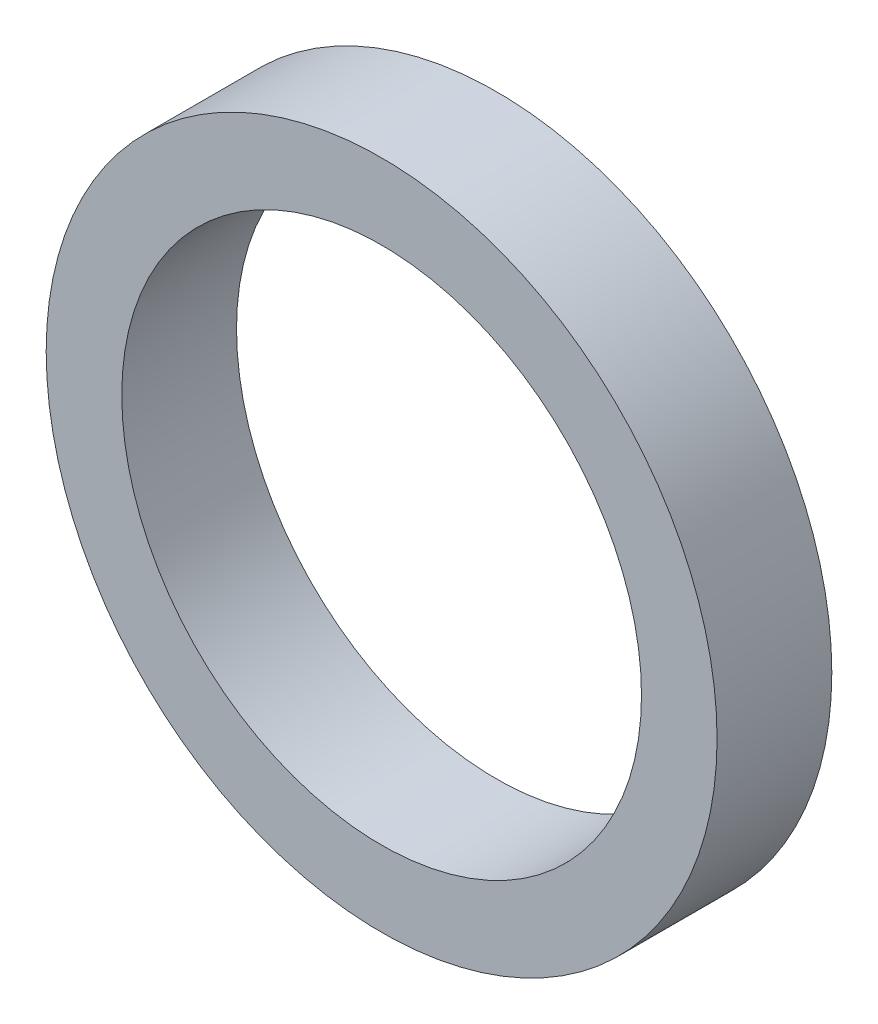
ISO-10303-21;
HEADER;
FILE_DESCRIPTION(('STEP AP214'),'2;1');
FILE_NAME('part.step','',(''),(''),'','','');
FILE_SCHEMA(('AUTOMOTIVE_DESIGN { 1 0 10303 214 1 1 1 1 }'));
ENDSEC;
DATA;
#1=APPLICATION_CONTEXT('core data for automotive mechanical design processes');
#2=APPLICATION_PROTOCOL_DEFINITION('international standard','automotive_design',2000,#1);
#3=PRODUCT_CONTEXT('',#1,'mechanical');
#4=PRODUCT('Part','Part','',(#3));
#5=PRODUCT_RELATED_PRODUCT_CATEGORY('part','',(#4));
#6=PRODUCT_DEFINITION_FORMATION('','',#4);
#7=PRODUCT_DEFINITION_CONTEXT('part definition',#1,'design');
#8=PRODUCT_DEFINITION('design','',#6,#7);
#9=PRODUCT_DEFINITION_SHAPE('','',#8);
#10=(LENGTH_UNIT() NAMED_UNIT(*) SI_UNIT(.MILLI.,.METRE.));
#11=(NAMED_UNIT(*) PLANE_ANGLE_UNIT() SI_UNIT($,.RADIAN.));
#12=(NAMED_UNIT(*) SI_UNIT($,.STERADIAN.) SOLID_ANGLE_UNIT());
#13=UNCERTAINTY_MEASURE_WITH_UNIT(LENGTH_MEASURE(1.E-05),#10,'distance_accuracy_value','');
#14=(GEOMETRIC_REPRESENTATION_CONTEXT(3) GLOBAL_UNCERTAINTY_ASSIGNED_CONTEXT((#13)) GLOBAL_UNIT_ASSIGNED_CONTEXT((#10,
#11,#12)) REPRESENTATION_CONTEXT('',''));
#15=CARTESIAN_POINT('',(0.,0.,0.));
#16=DIRECTION('',(0.,0.,1.));
#17=DIRECTION('',(1.,0.,0.));
#18=AXIS2_PLACEMENT_3D('',#15,#16,#17);
#19=CARTESIAN_POINT('',(0.,0.,47.4784409027825));
#20=DIRECTION('',(0.,0.,-1.));
#21=DIRECTION('',(-1.,0.,0.));
#22=AXIS2_PLACEMENT_3D('',#19,#20,#21);
#23=CYLINDRICAL_SURFACE('',#22,215.748780306384);
#24=CARTESIAN_POINT('',(0.,0.,47.4784409027825));
#25=DIRECTION('',(0.,0.,1.));
#26=DIRECTION('',(1.,0.,0.));
#27=AXIS2_PLACEMENT_3D('',#24,#25,#26);
#28=CIRCLE('',#27,215.748780306384);
#29=CARTESIAN_POINT('',(215.748780306384,0.,47.4784409027825));
#30=VERTEX_POINT('',#29);
#31=EDGE_CURVE('E47',#30,#30,#28,.T.);
#32=ORIENTED_EDGE('',*,*,#31,.T.);
#33=EDGE_LOOP('',(#32));
#34=FACE_BOUND('',#33,.T.);
#35=CARTESIAN_POINT('',(0.,0.,-47.7888543819998));
#36=DIRECTION('',(0.,0.,1.));
#37=DIRECTION('',(1.,0.,0.));
#38=AXIS2_PLACEMENT_3D('',#35,#36,#37);
#39=CIRCLE('',#38,215.748780306384);
#40=CARTESIAN_POINT('',(215.748780306384,0.,-47.7888543819998));
#41=VERTEX_POINT('',#40);
#42=EDGE_CURVE('E55',#41,#41,#39,.T.);
#43=ORIENTED_EDGE('',*,*,#42,.F.);
#44=EDGE_LOOP('',(#43));
#45=FACE_BOUND('',#44,.T.);
#46=ADVANCED_FACE('F41',(#34,#45),#23,.F.);
#47=CARTESIAN_POINT('',(0.,0.,47.4784409027825));
#48=DIRECTION('',(0.,0.,-1.));
#49=DIRECTION('',(-1.,0.,0.));
#50=AXIS2_PLACEMENT_3D('',#47,#48,#49);
#51=CYLINDRICAL_SURFACE('',#50,278.5);
#52=CARTESIAN_POINT('',(0.,0.,47.4784409027825));
#53=DIRECTION('',(0.,0.,1.));
#54=DIRECTION('',(1.,0.,0.));
#55=AXIS2_PLACEMENT_3D('',#52,#53,#54);
#56=CIRCLE('',#55,278.5);
#57=CARTESIAN_POINT('',(278.5,0.,47.4784409027825));
#58=VERTEX_POINT('',#57);
#59=EDGE_CURVE('E10',#58,#58,#56,.T.);
#60=ORIENTED_EDGE('',*,*,#59,.F.);
#61=EDGE_LOOP('',(#60));
#62=FACE_BOUND('',#61,.T.);
#63=CARTESIAN_POINT('',(0.,0.,-47.7888543819998));
#64=DIRECTION('',(0.,0.,1.));
#65=DIRECTION('',(1.,0.,0.));
#66=AXIS2_PLACEMENT_3D('',#63,#64,#65);
#67=CIRCLE('',#66,278.5);
#68=CARTESIAN_POINT('',(278.5,0.,-47.7888543819998));
#69=VERTEX_POINT('',#68);
#70=EDGE_CURVE('E51',#69,#69,#67,.T.);
#71=ORIENTED_EDGE('',*,*,#70,.T.);
#72=EDGE_LOOP('',(#71));
#73=FACE_BOUND('',#72,.T.);
#74=ADVANCED_FACE('F65',(#62,#73),#51,.T.);
#75=CARTESIAN_POINT('',(0.,0.,47.4784409027825));
#76=DIRECTION('',(0.,0.,1.));
#77=DIRECTION('',(1.,0.,0.));
#78=AXIS2_PLACEMENT_3D('',#75,#76,#77);
#79=PLANE('',#78);
#80=ORIENTED_EDGE('',*,*,#31,.F.);
#81=EDGE_LOOP('',(#80));
#82=FACE_BOUND('',#81,.T.);
#83=ORIENTED_EDGE('',*,*,#59,.T.);
#84=EDGE_LOOP('',(#83));
#85=FACE_BOUND('',#84,.T.);
#86=ADVANCED_FACE('F69',(#82,#85),#79,.T.);
#87=CARTESIAN_POINT('',(0.,0.,-47.7888543819998));
#88=DIRECTION('',(0.,0.,1.));
#89=DIRECTION('',(1.,0.,0.));
#90=AXIS2_PLACEMENT_3D('',#87,#88,#89);
#91=PLANE('',#90);
#92=ORIENTED_EDGE('',*,*,#42,.T.);
#93=EDGE_LOOP('',(#92));
#94=FACE_BOUND('',#93,.T.);
#95=ORIENTED_EDGE('',*,*,#70,.F.);
#96=EDGE_LOOP('',(#95));
#97=FACE_BOUND('',#96,.T.);
#98=ADVANCED_FACE('F61',(#94,#97),#91,.F.);
#99=CLOSED_SHELL('',(#46,#74,#86,#98));
#100=MANIFOLD_SOLID_BREP('B2',#99);
#101=ADVANCED_BREP_SHAPE_REPRESENTATION('',(#18,#100),#14);
#102=SHAPE_DEFINITION_REPRESENTATION(#9,#101);
ENDSEC;
END-ISO-10303-21;
